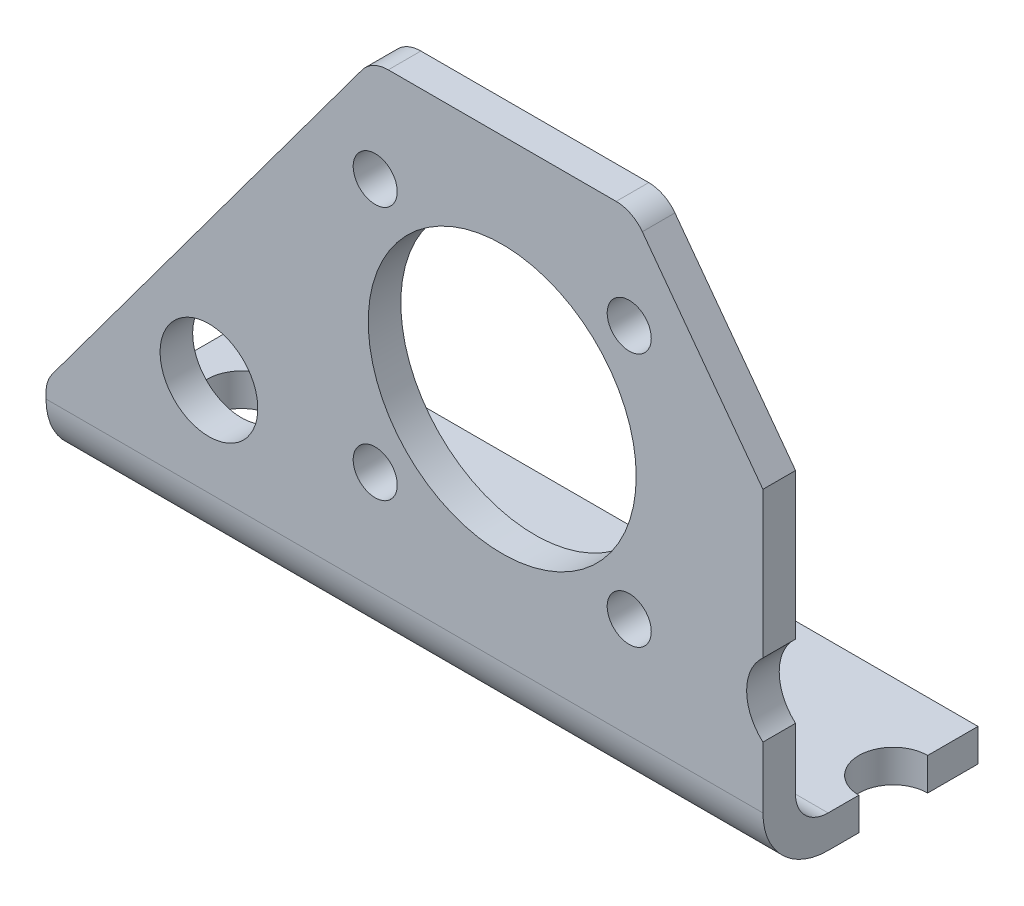
ISO-10303-21;
HEADER;
FILE_DESCRIPTION(('STEP AP214'),'2;1');
FILE_NAME('part.step','',(''),(''),'','','');
FILE_SCHEMA(('AUTOMOTIVE_DESIGN { 1 0 10303 214 1 1 1 1 }'));
ENDSEC;
DATA;
#1=APPLICATION_CONTEXT('core data for automotive mechanical design processes');
#2=APPLICATION_PROTOCOL_DEFINITION('international standard','automotive_design',2000,#1);
#3=PRODUCT_CONTEXT('',#1,'mechanical');
#4=PRODUCT('Part','Part','',(#3));
#5=PRODUCT_RELATED_PRODUCT_CATEGORY('part','',(#4));
#6=PRODUCT_DEFINITION_FORMATION('','',#4);
#7=PRODUCT_DEFINITION_CONTEXT('part definition',#1,'design');
#8=PRODUCT_DEFINITION('design','',#6,#7);
#9=PRODUCT_DEFINITION_SHAPE('','',#8);
#10=(LENGTH_UNIT() NAMED_UNIT(*) SI_UNIT(.MILLI.,.METRE.));
#11=(NAMED_UNIT(*) PLANE_ANGLE_UNIT() SI_UNIT($,.RADIAN.));
#12=(NAMED_UNIT(*) SI_UNIT($,.STERADIAN.) SOLID_ANGLE_UNIT());
#13=UNCERTAINTY_MEASURE_WITH_UNIT(LENGTH_MEASURE(1.E-05),#10,'distance_accuracy_value','');
#14=(GEOMETRIC_REPRESENTATION_CONTEXT(3) GLOBAL_UNCERTAINTY_ASSIGNED_CONTEXT((#13)) GLOBAL_UNIT_ASSIGNED_CONTEXT((#10,
#11,#12)) REPRESENTATION_CONTEXT('',''));
#15=CARTESIAN_POINT('',(0.,0.,0.));
#16=DIRECTION('',(0.,0.,1.));
#17=DIRECTION('',(1.,0.,0.));
#18=AXIS2_PLACEMENT_3D('',#15,#16,#17);
#19=CARTESIAN_POINT('',(25.4,-36.9183275870067,0.));
#20=DIRECTION('',(-1.,0.,0.));
#21=DIRECTION('',(0.,0.,1.));
#22=AXIS2_PLACEMENT_3D('',#19,#20,#21);
#23=PLANE('',#22);
#24=DIRECTION('',(0.,0.,1.));
#25=VECTOR('',#24,1.);
#26=CARTESIAN_POINT('',(25.4,-28.575,0.));
#27=LINE('',#26,#25);
#28=CARTESIAN_POINT('',(25.4,-28.5750000000001,-16.0527999999998));
#29=VERTEX_POINT('',#28);
#30=CARTESIAN_POINT('',(25.4,-28.575,-20.955));
#31=VERTEX_POINT('',#30);
#32=EDGE_CURVE('E153',#29,#31,#27,.F.);
#33=ORIENTED_EDGE('',*,*,#32,.T.);
#34=DIRECTION('',(0.,-1.,0.));
#35=VECTOR('',#34,1.);
#36=CARTESIAN_POINT('',(25.4,-28.575,-20.955));
#37=LINE('',#36,#35);
#38=CARTESIAN_POINT('',(25.4,-25.4000000000001,-20.955));
#39=VERTEX_POINT('',#38);
#40=EDGE_CURVE('E216',#31,#39,#37,.F.);
#41=ORIENTED_EDGE('',*,*,#40,.T.);
#42=DIRECTION('',(0.,0.,1.));
#43=VECTOR('',#42,1.);
#44=CARTESIAN_POINT('',(25.4,-25.4,-3.175));
#45=LINE('',#44,#43);
#46=CARTESIAN_POINT('',(25.4,-25.4,-16.0527999999998));
#47=VERTEX_POINT('',#46);
#48=EDGE_CURVE('E188',#47,#39,#45,.F.);
#49=ORIENTED_EDGE('',*,*,#48,.F.);
#50=DIRECTION('',(0.,1.,0.));
#51=VECTOR('',#50,1.);
#52=CARTESIAN_POINT('',(25.4,-28.575,-16.0527999999998));
#53=LINE('',#52,#51);
#54=EDGE_CURVE('E154',#47,#29,#53,.F.);
#55=ORIENTED_EDGE('',*,*,#54,.T.);
#56=EDGE_LOOP('',(#33,#41,#49,#55));
#57=FACE_BOUND('',#56,.T.);
#58=ADVANCED_FACE('F17',(#57),#23,.F.);
#59=CARTESIAN_POINT('',(44.45,-28.575,-20.955));
#60=DIRECTION('',(0.,0.,1.));
#61=DIRECTION('',(0.,-1.,0.));
#62=AXIS2_PLACEMENT_3D('',#59,#60,#61);
#63=PLANE('',#62);
#64=DIRECTION('',(1.,0.,0.));
#65=VECTOR('',#64,1.);
#66=CARTESIAN_POINT('',(44.45,-28.575,-20.955));
#67=LINE('',#66,#65);
#68=CARTESIAN_POINT('',(-41.275,-28.575,-20.955));
#69=VERTEX_POINT('',#68);
#70=EDGE_CURVE('E211',#31,#69,#67,.F.);
#71=ORIENTED_EDGE('',*,*,#70,.T.);
#72=DIRECTION('',(0.,1.,0.));
#73=VECTOR('',#72,1.);
#74=CARTESIAN_POINT('',(-41.275,-28.575,-20.955));
#75=LINE('',#74,#73);
#76=CARTESIAN_POINT('',(-41.275,-25.4,-20.955));
#77=VERTEX_POINT('',#76);
#78=EDGE_CURVE('E221',#77,#69,#75,.F.);
#79=ORIENTED_EDGE('',*,*,#78,.F.);
#80=DIRECTION('',(1.,0.,0.));
#81=VECTOR('',#80,1.);
#82=CARTESIAN_POINT('',(44.45,-25.4000000000001,-20.955));
#83=LINE('',#82,#81);
#84=EDGE_CURVE('E185',#39,#77,#83,.F.);
#85=ORIENTED_EDGE('',*,*,#84,.F.);
#86=ORIENTED_EDGE('',*,*,#40,.F.);
#87=EDGE_LOOP('',(#71,#79,#85,#86));
#88=FACE_BOUND('',#87,.T.);
#89=ADVANCED_FACE('F219',(#88),#63,.F.);
#90=CARTESIAN_POINT('',(-41.275,-28.575,-17.78));
#91=DIRECTION('',(0.,1.,0.));
#92=DIRECTION('',(0.,0.,1.));
#93=AXIS2_PLACEMENT_3D('',#90,#91,#92);
#94=CYLINDRICAL_SURFACE('',#93,3.175);
#95=CARTESIAN_POINT('',(-41.275,-25.4,-17.78));
#96=DIRECTION('',(0.,1.,0.));
#97=DIRECTION('',(0.,0.,1.));
#98=AXIS2_PLACEMENT_3D('',#95,#96,#97);
#99=CIRCLE('',#98,3.175);
#100=CARTESIAN_POINT('',(-44.45,-25.4,-17.78));
#101=VERTEX_POINT('',#100);
#102=EDGE_CURVE('E182',#77,#101,#99,.T.);
#103=ORIENTED_EDGE('',*,*,#102,.F.);
#104=ORIENTED_EDGE('',*,*,#78,.T.);
#105=CARTESIAN_POINT('',(-41.275,-28.575,-17.78));
#106=DIRECTION('',(0.,1.,0.));
#107=DIRECTION('',(0.,0.,1.));
#108=AXIS2_PLACEMENT_3D('',#105,#106,#107);
#109=CIRCLE('',#108,3.175);
#110=CARTESIAN_POINT('',(-44.45,-28.575,-17.78));
#111=VERTEX_POINT('',#110);
#112=EDGE_CURVE('E209',#69,#111,#109,.T.);
#113=ORIENTED_EDGE('',*,*,#112,.T.);
#114=DIRECTION('',(0.,1.,0.));
#115=VECTOR('',#114,1.);
#116=CARTESIAN_POINT('',(-44.45,-28.575,-17.78));
#117=LINE('',#116,#115);
#118=EDGE_CURVE('E229',#111,#101,#117,.T.);
#119=ORIENTED_EDGE('',*,*,#118,.T.);
#120=EDGE_LOOP('',(#103,#104,#113,#119));
#121=FACE_BOUND('',#120,.T.);
#122=ADVANCED_FACE('F228',(#121),#94,.T.);
#123=CARTESIAN_POINT('',(-38.1,-28.575,-12.6999999999998));
#124=DIRECTION('',(0.,1.,0.));
#125=DIRECTION('',(0.,0.,1.));
#126=AXIS2_PLACEMENT_3D('',#123,#124,#125);
#127=CYLINDRICAL_SURFACE('',#126,3.3528);
#128=CARTESIAN_POINT('',(-38.1,-25.4,-12.6999999999998));
#129=DIRECTION('',(0.,1.,0.));
#130=DIRECTION('',(0.,0.,1.));
#131=AXIS2_PLACEMENT_3D('',#128,#129,#130);
#132=CIRCLE('',#131,3.3528);
#133=CARTESIAN_POINT('',(-38.1,-25.4,-9.34719999999983));
#134=VERTEX_POINT('',#133);
#135=EDGE_CURVE('E176',#134,#134,#132,.F.);
#136=ORIENTED_EDGE('',*,*,#135,.F.);
#137=EDGE_LOOP('',(#136));
#138=FACE_BOUND('',#137,.T.);
#139=CARTESIAN_POINT('',(-38.1,-28.575,-12.6999999999998));
#140=DIRECTION('',(0.,1.,0.));
#141=DIRECTION('',(0.,0.,1.));
#142=AXIS2_PLACEMENT_3D('',#139,#140,#141);
#143=CIRCLE('',#142,3.3528);
#144=CARTESIAN_POINT('',(-38.1,-28.575,-9.34719999999982));
#145=VERTEX_POINT('',#144);
#146=EDGE_CURVE('E200',#145,#145,#143,.F.);
#147=ORIENTED_EDGE('',*,*,#146,.T.);
#148=EDGE_LOOP('',(#147));
#149=FACE_BOUND('',#148,.T.);
#150=ADVANCED_FACE('F621',(#138,#149),#127,.F.);
#151=CARTESIAN_POINT('',(-25.4,-28.575,-12.6999999999998));
#152=DIRECTION('',(0.,1.,0.));
#153=DIRECTION('',(0.,0.,1.));
#154=AXIS2_PLACEMENT_3D('',#151,#152,#153);
#155=CYLINDRICAL_SURFACE('',#154,3.3528);
#156=CARTESIAN_POINT('',(-25.4,-25.4,-12.6999999999998));
#157=DIRECTION('',(0.,1.,0.));
#158=DIRECTION('',(0.,0.,1.));
#159=AXIS2_PLACEMENT_3D('',#156,#157,#158);
#160=CIRCLE('',#159,3.3528);
#161=CARTESIAN_POINT('',(-25.4,-25.4,-9.34719999999983));
#162=VERTEX_POINT('',#161);
#163=EDGE_CURVE('E173',#162,#162,#160,.F.);
#164=ORIENTED_EDGE('',*,*,#163,.F.);
#165=EDGE_LOOP('',(#164));
#166=FACE_BOUND('',#165,.T.);
#167=CARTESIAN_POINT('',(-25.4,-28.575,-12.6999999999998));
#168=DIRECTION('',(0.,1.,0.));
#169=DIRECTION('',(0.,0.,1.));
#170=AXIS2_PLACEMENT_3D('',#167,#168,#169);
#171=CIRCLE('',#170,3.3528);
#172=CARTESIAN_POINT('',(-25.4,-28.575,-9.34719999999982));
#173=VERTEX_POINT('',#172);
#174=EDGE_CURVE('E203',#173,#173,#171,.F.);
#175=ORIENTED_EDGE('',*,*,#174,.T.);
#176=EDGE_LOOP('',(#175));
#177=FACE_BOUND('',#176,.T.);
#178=ADVANCED_FACE('F612',(#166,#177),#155,.F.);
#179=CARTESIAN_POINT('',(0.,-28.5750000000003,-12.6999999999998));
#180=DIRECTION('',(0.,1.,0.));
#181=DIRECTION('',(0.,0.,1.));
#182=AXIS2_PLACEMENT_3D('',#179,#180,#181);
#183=CYLINDRICAL_SURFACE('',#182,6.35);
#184=CARTESIAN_POINT('',(0.,-25.4,-12.6999999999998));
#185=DIRECTION('',(0.,1.,0.));
#186=DIRECTION('',(0.,0.,1.));
#187=AXIS2_PLACEMENT_3D('',#184,#185,#186);
#188=CIRCLE('',#187,6.35);
#189=CARTESIAN_POINT('',(0.,-25.4,-6.34999999999983));
#190=VERTEX_POINT('',#189);
#191=EDGE_CURVE('E169',#190,#190,#188,.F.);
#192=ORIENTED_EDGE('',*,*,#191,.F.);
#193=EDGE_LOOP('',(#192));
#194=FACE_BOUND('',#193,.T.);
#195=CARTESIAN_POINT('',(0.,-28.575,-12.6999999999998));
#196=DIRECTION('',(0.,1.,0.));
#197=DIRECTION('',(0.,0.,1.));
#198=AXIS2_PLACEMENT_3D('',#195,#196,#197);
#199=CIRCLE('',#198,6.35);
#200=CARTESIAN_POINT('',(0.,-28.575,-6.34999999999982));
#201=VERTEX_POINT('',#200);
#202=EDGE_CURVE('E197',#201,#201,#199,.F.);
#203=ORIENTED_EDGE('',*,*,#202,.T.);
#204=EDGE_LOOP('',(#203));
#205=FACE_BOUND('',#204,.T.);
#206=ADVANCED_FACE('F604',(#194,#205),#183,.F.);
#207=CARTESIAN_POINT('',(25.4,-28.575,-12.6999999999998));
#208=DIRECTION('',(0.,1.,0.));
#209=DIRECTION('',(0.,0.,1.));
#210=AXIS2_PLACEMENT_3D('',#207,#208,#209);
#211=CYLINDRICAL_SURFACE('',#210,3.3528);
#212=CARTESIAN_POINT('',(25.4,-28.5750000000002,-12.6999999999998));
#213=DIRECTION('',(0.,1.,0.));
#214=DIRECTION('',(0.,0.,1.));
#215=AXIS2_PLACEMENT_3D('',#212,#213,#214);
#216=CIRCLE('',#215,3.3528);
#217=CARTESIAN_POINT('',(25.4,-28.5750000000001,-9.34719999999982));
#218=VERTEX_POINT('',#217);
#219=EDGE_CURVE('E20',#218,#29,#216,.F.);
#220=ORIENTED_EDGE('',*,*,#219,.T.);
#221=ORIENTED_EDGE('',*,*,#54,.F.);
#222=CARTESIAN_POINT('',(25.4,-25.4,-12.6999999999998));
#223=DIRECTION('',(0.,1.,0.));
#224=DIRECTION('',(0.,0.,1.));
#225=AXIS2_PLACEMENT_3D('',#222,#223,#224);
#226=CIRCLE('',#225,3.3528);
#227=CARTESIAN_POINT('',(25.4,-25.4,-9.34719999999983));
#228=VERTEX_POINT('',#227);
#229=EDGE_CURVE('E141',#228,#47,#226,.F.);
#230=ORIENTED_EDGE('',*,*,#229,.F.);
#231=DIRECTION('',(0.,1.,0.));
#232=VECTOR('',#231,1.);
#233=CARTESIAN_POINT('',(25.4,-36.9183275870067,-9.34719999999982));
#234=LINE('',#233,#232);
#235=EDGE_CURVE('E136',#228,#218,#234,.F.);
#236=ORIENTED_EDGE('',*,*,#235,.T.);
#237=EDGE_LOOP('',(#220,#221,#230,#236));
#238=FACE_BOUND('',#237,.T.);
#239=ADVANCED_FACE('F138',(#238),#211,.F.);
#240=CARTESIAN_POINT('',(44.45,-28.575,-3.175));
#241=DIRECTION('',(0.,1.,0.));
#242=DIRECTION('',(0.,0.,1.));
#243=AXIS2_PLACEMENT_3D('',#240,#241,#242);
#244=PLANE('',#243);
#245=ORIENTED_EDGE('',*,*,#202,.F.);
#246=EDGE_LOOP('',(#245));
#247=FACE_BOUND('',#246,.T.);
#248=ORIENTED_EDGE('',*,*,#146,.F.);
#249=EDGE_LOOP('',(#248));
#250=FACE_BOUND('',#249,.T.);
#251=ORIENTED_EDGE('',*,*,#174,.F.);
#252=EDGE_LOOP('',(#251));
#253=FACE_BOUND('',#252,.T.);
#254=DIRECTION('',(-1.,0.,0.));
#255=VECTOR('',#254,1.);
#256=CARTESIAN_POINT('',(-44.45,-28.575,-6.34999999999998));
#257=LINE('',#256,#255);
#258=CARTESIAN_POINT('',(-44.45,-28.575,-6.34999999999999));
#259=VERTEX_POINT('',#258);
#260=CARTESIAN_POINT('',(25.4,-28.575,-6.34999999999997));
#261=VERTEX_POINT('',#260);
#262=EDGE_CURVE('E195',#259,#261,#257,.F.);
#263=ORIENTED_EDGE('',*,*,#262,.F.);
#264=DIRECTION('',(0.,0.,1.));
#265=VECTOR('',#264,1.);
#266=CARTESIAN_POINT('',(-44.45,-28.575,-20.955));
#267=LINE('',#266,#265);
#268=EDGE_CURVE('E206',#111,#259,#267,.T.);
#269=ORIENTED_EDGE('',*,*,#268,.F.);
#270=ORIENTED_EDGE('',*,*,#112,.F.);
#271=ORIENTED_EDGE('',*,*,#70,.F.);
#272=ORIENTED_EDGE('',*,*,#32,.F.);
#273=ORIENTED_EDGE('',*,*,#219,.F.);
#274=DIRECTION('',(0.,0.,1.));
#275=VECTOR('',#274,1.);
#276=CARTESIAN_POINT('',(25.4,-28.575,-3.175));
#277=LINE('',#276,#275);
#278=EDGE_CURVE('E146',#218,#261,#277,.T.);
#279=ORIENTED_EDGE('',*,*,#278,.T.);
#280=EDGE_LOOP('',(#263,#269,#270,#271,#272,#273,#279));
#281=FACE_BOUND('',#280,.T.);
#282=ADVANCED_FACE('F150',(#247,#250,#253,#281),#244,.F.);
#283=CARTESIAN_POINT('',(-44.45,-22.225,-6.35));
#284=DIRECTION('',(-1.,0.,0.));
#285=DIRECTION('',(0.,0.,1.));
#286=AXIS2_PLACEMENT_3D('',#283,#284,#285);
#287=CYLINDRICAL_SURFACE('',#286,6.35);
#288=CARTESIAN_POINT('',(-44.45,-22.225,-6.35));
#289=DIRECTION('',(-1.,0.,0.));
#290=DIRECTION('',(0.,0.,1.));
#291=AXIS2_PLACEMENT_3D('',#288,#289,#290);
#292=CIRCLE('',#291,6.35);
#293=CARTESIAN_POINT('',(-44.45,-22.225,0.));
#294=VERTEX_POINT('',#293);
#295=EDGE_CURVE('E192',#294,#259,#292,.F.);
#296=ORIENTED_EDGE('',*,*,#295,.T.);
#297=ORIENTED_EDGE('',*,*,#262,.T.);
#298=CARTESIAN_POINT('',(25.4,-22.225,-6.34999999999999));
#299=DIRECTION('',(-1.,0.,0.));
#300=DIRECTION('',(0.,0.,1.));
#301=AXIS2_PLACEMENT_3D('',#298,#299,#300);
#302=CIRCLE('',#301,6.35);
#303=CARTESIAN_POINT('',(25.4,-22.225,0.));
#304=VERTEX_POINT('',#303);
#305=EDGE_CURVE('E158',#261,#304,#302,.T.);
#306=ORIENTED_EDGE('',*,*,#305,.T.);
#307=DIRECTION('',(-1.,0.,0.));
#308=VECTOR('',#307,1.);
#309=CARTESIAN_POINT('',(0.,-22.225,0.));
#310=LINE('',#309,#308);
#311=EDGE_CURVE('E323',#304,#294,#310,.T.);
#312=ORIENTED_EDGE('',*,*,#311,.T.);
#313=EDGE_LOOP('',(#296,#297,#306,#312));
#314=FACE_BOUND('',#313,.T.);
#315=ADVANCED_FACE('F340',(#314),#287,.T.);
#316=CARTESIAN_POINT('',(44.45,-25.4,-3.175));
#317=DIRECTION('',(0.,1.,0.));
#318=DIRECTION('',(0.,0.,1.));
#319=AXIS2_PLACEMENT_3D('',#316,#317,#318);
#320=PLANE('',#319);
#321=ORIENTED_EDGE('',*,*,#191,.T.);
#322=EDGE_LOOP('',(#321));
#323=FACE_BOUND('',#322,.T.);
#324=ORIENTED_EDGE('',*,*,#163,.T.);
#325=EDGE_LOOP('',(#324));
#326=FACE_BOUND('',#325,.T.);
#327=ORIENTED_EDGE('',*,*,#135,.T.);
#328=EDGE_LOOP('',(#327));
#329=FACE_BOUND('',#328,.T.);
#330=DIRECTION('',(0.,0.,1.));
#331=VECTOR('',#330,1.);
#332=CARTESIAN_POINT('',(-44.45,-25.4,-3.175));
#333=LINE('',#332,#331);
#334=CARTESIAN_POINT('',(-44.45,-25.4,-6.34999999999999));
#335=VERTEX_POINT('',#334);
#336=EDGE_CURVE('E179',#101,#335,#333,.T.);
#337=ORIENTED_EDGE('',*,*,#336,.T.);
#338=DIRECTION('',(1.,0.,0.));
#339=VECTOR('',#338,1.);
#340=CARTESIAN_POINT('',(44.45,-25.4,-6.35));
#341=LINE('',#340,#339);
#342=CARTESIAN_POINT('',(25.4,-25.4,-6.34999999999999));
#343=VERTEX_POINT('',#342);
#344=EDGE_CURVE('E306',#335,#343,#341,.T.);
#345=ORIENTED_EDGE('',*,*,#344,.T.);
#346=DIRECTION('',(0.,0.,1.));
#347=VECTOR('',#346,1.);
#348=CARTESIAN_POINT('',(25.4,-25.4,-3.175));
#349=LINE('',#348,#347);
#350=EDGE_CURVE('E147',#343,#228,#349,.F.);
#351=ORIENTED_EDGE('',*,*,#350,.T.);
#352=ORIENTED_EDGE('',*,*,#229,.T.);
#353=ORIENTED_EDGE('',*,*,#48,.T.);
#354=ORIENTED_EDGE('',*,*,#84,.T.);
#355=ORIENTED_EDGE('',*,*,#102,.T.);
#356=EDGE_LOOP('',(#337,#345,#351,#352,#353,#354,#355));
#357=FACE_BOUND('',#356,.T.);
#358=ADVANCED_FACE('F362',(#323,#326,#329,#357),#320,.T.);
#359=CARTESIAN_POINT('',(-44.45,-28.575,-3.175));
#360=DIRECTION('',(-1.,0.,0.));
#361=DIRECTION('',(0.,0.,1.));
#362=AXIS2_PLACEMENT_3D('',#359,#360,#361);
#363=PLANE('',#362);
#364=DIRECTION('',(0.,1.,0.));
#365=VECTOR('',#364,1.);
#366=CARTESIAN_POINT('',(-44.45,-28.575,-3.175));
#367=LINE('',#366,#365);
#368=CARTESIAN_POINT('',(-44.45,-21.6853444932106,-3.175));
#369=VERTEX_POINT('',#368);
#370=CARTESIAN_POINT('',(-44.45,-22.225,-3.175));
#371=VERTEX_POINT('',#370);
#372=EDGE_CURVE('E172',#369,#371,#367,.F.);
#373=ORIENTED_EDGE('',*,*,#372,.T.);
#374=CARTESIAN_POINT('',(-44.45,-22.225,-6.35));
#375=DIRECTION('',(-1.,0.,0.));
#376=DIRECTION('',(0.,0.,1.));
#377=AXIS2_PLACEMENT_3D('',#374,#375,#376);
#378=CIRCLE('',#377,3.175);
#379=EDGE_CURVE('E307',#371,#335,#378,.F.);
#380=ORIENTED_EDGE('',*,*,#379,.T.);
#381=ORIENTED_EDGE('',*,*,#336,.F.);
#382=ORIENTED_EDGE('',*,*,#118,.F.);
#383=ORIENTED_EDGE('',*,*,#268,.T.);
#384=ORIENTED_EDGE('',*,*,#295,.F.);
#385=DIRECTION('',(0.,1.,0.));
#386=VECTOR('',#385,1.);
#387=CARTESIAN_POINT('',(-44.45,39.37,0.));
#388=LINE('',#387,#386);
#389=CARTESIAN_POINT('',(-44.45,-21.6853444932106,0.));
#390=VERTEX_POINT('',#389);
#391=EDGE_CURVE('E321',#294,#390,#388,.T.);
#392=ORIENTED_EDGE('',*,*,#391,.T.);
#393=DIRECTION('',(0.,0.,1.));
#394=VECTOR('',#393,1.);
#395=CARTESIAN_POINT('',(-44.45,-21.6853444932106,-3.175));
#396=LINE('',#395,#394);
#397=EDGE_CURVE('E303',#369,#390,#396,.T.);
#398=ORIENTED_EDGE('',*,*,#397,.F.);
#399=EDGE_LOOP('',(#373,#380,#381,#382,#383,#384,#392,#398));
#400=FACE_BOUND('',#399,.T.);
#401=ADVANCED_FACE('F233',(#400),#363,.T.);
#402=CARTESIAN_POINT('',(0.,39.37,0.));
#403=DIRECTION('',(0.,0.,-1.));
#404=DIRECTION('',(-1.,0.,0.));
#405=AXIS2_PLACEMENT_3D('',#402,#403,#404);
#406=PLANE('',#405);
#407=CARTESIAN_POINT('',(-12.3747929348331,12.3747929348334,0.));
#408=DIRECTION('',(0.,0.,1.));
#409=DIRECTION('',(1.,0.,0.));
#410=AXIS2_PLACEMENT_3D('',#407,#408,#409);
#411=CIRCLE('',#410,2.1463);
#412=CARTESIAN_POINT('',(-10.2284929348331,12.3747929348334,0.));
#413=VERTEX_POINT('',#412);
#414=EDGE_CURVE('E287',#413,#413,#411,.F.);
#415=ORIENTED_EDGE('',*,*,#414,.T.);
#416=EDGE_LOOP('',(#415));
#417=FACE_BOUND('',#416,.T.);
#418=CARTESIAN_POINT('',(-12.3747929348334,-12.3747929348332,0.));
#419=DIRECTION('',(0.,0.,1.));
#420=DIRECTION('',(1.,0.,0.));
#421=AXIS2_PLACEMENT_3D('',#418,#419,#420);
#422=CIRCLE('',#421,2.1463);
#423=CARTESIAN_POINT('',(-10.2284929348334,-12.3747929348332,0.));
#424=VERTEX_POINT('',#423);
#425=EDGE_CURVE('E284',#424,#424,#422,.F.);
#426=ORIENTED_EDGE('',*,*,#425,.T.);
#427=EDGE_LOOP('',(#426));
#428=FACE_BOUND('',#427,.T.);
#429=CARTESIAN_POINT('',(12.3747929348332,-12.3747929348334,0.));
#430=DIRECTION('',(0.,0.,1.));
#431=DIRECTION('',(1.,0.,0.));
#432=AXIS2_PLACEMENT_3D('',#429,#430,#431);
#433=CIRCLE('',#432,2.1463);
#434=CARTESIAN_POINT('',(14.5210929348332,-12.3747929348334,0.));
#435=VERTEX_POINT('',#434);
#436=EDGE_CURVE('E281',#435,#435,#433,.F.);
#437=ORIENTED_EDGE('',*,*,#436,.T.);
#438=EDGE_LOOP('',(#437));
#439=FACE_BOUND('',#438,.T.);
#440=CARTESIAN_POINT('',(12.3747929348333,12.3747929348333,0.));
#441=DIRECTION('',(0.,0.,1.));
#442=DIRECTION('',(1.,0.,0.));
#443=AXIS2_PLACEMENT_3D('',#440,#441,#442);
#444=CIRCLE('',#443,2.1463);
#445=CARTESIAN_POINT('',(14.5210929348333,12.3747929348333,0.));
#446=VERTEX_POINT('',#445);
#447=EDGE_CURVE('E278',#446,#446,#444,.F.);
#448=ORIENTED_EDGE('',*,*,#447,.T.);
#449=EDGE_LOOP('',(#448));
#450=FACE_BOUND('',#449,.T.);
#451=CARTESIAN_POINT('',(0.,0.,0.));
#452=DIRECTION('',(0.,0.,1.));
#453=DIRECTION('',(1.,0.,0.));
#454=AXIS2_PLACEMENT_3D('',#451,#452,#453);
#455=CIRCLE('',#454,13.0556);
#456=CARTESIAN_POINT('',(13.0556,0.,0.));
#457=VERTEX_POINT('',#456);
#458=EDGE_CURVE('E275',#457,#457,#455,.F.);
#459=ORIENTED_EDGE('',*,*,#458,.T.);
#460=EDGE_LOOP('',(#459));
#461=FACE_BOUND('',#460,.T.);
#462=CARTESIAN_POINT('',(-28.575,-12.7,0.));
#463=DIRECTION('',(0.,0.,-1.));
#464=DIRECTION('',(-1.,0.,0.));
#465=AXIS2_PLACEMENT_3D('',#462,#463,#464);
#466=CIRCLE('',#465,4.7625);
#467=CARTESIAN_POINT('',(-33.3375,-12.7,0.));
#468=VERTEX_POINT('',#467);
#469=EDGE_CURVE('E272',#468,#468,#466,.T.);
#470=ORIENTED_EDGE('',*,*,#469,.T.);
#471=EDGE_LOOP('',(#470));
#472=FACE_BOUND('',#471,.T.);
#473=DIRECTION('',(-0.595227550625738,0.803557193344746,0.));
#474=VECTOR('',#473,1.);
#475=CARTESIAN_POINT('',(12.7,22.225,0.));
#476=LINE('',#475,#474);
#477=CARTESIAN_POINT('',(13.6519648346395,20.9398474732367,0.));
#478=VERTEX_POINT('',#477);
#479=CARTESIAN_POINT('',(25.4,5.08,0.));
#480=VERTEX_POINT('',#479);
#481=EDGE_CURVE('E290',#478,#480,#476,.F.);
#482=ORIENTED_EDGE('',*,*,#481,.F.);
#483=CARTESIAN_POINT('',(11.1006707457699,19.05,0.));
#484=DIRECTION('',(0.,0.,1.));
#485=DIRECTION('',(1.,0.,0.));
#486=AXIS2_PLACEMENT_3D('',#483,#484,#485);
#487=CIRCLE('',#486,3.175);
#488=CARTESIAN_POINT('',(11.1006707457699,22.225,0.));
#489=VERTEX_POINT('',#488);
#490=EDGE_CURVE('E291',#489,#478,#487,.F.);
#491=ORIENTED_EDGE('',*,*,#490,.F.);
#492=DIRECTION('',(1.,0.,0.));
#493=VECTOR('',#492,1.);
#494=CARTESIAN_POINT('',(-12.7,22.225,0.));
#495=LINE('',#494,#493);
#496=CARTESIAN_POINT('',(-11.1006707457699,22.225,0.));
#497=VERTEX_POINT('',#496);
#498=EDGE_CURVE('E298',#497,#489,#495,.T.);
#499=ORIENTED_EDGE('',*,*,#498,.F.);
#500=CARTESIAN_POINT('',(-11.1006707457699,19.05,0.));
#501=DIRECTION('',(0.,0.,1.));
#502=DIRECTION('',(1.,0.,0.));
#503=AXIS2_PLACEMENT_3D('',#500,#501,#502);
#504=CIRCLE('',#503,3.175);
#505=CARTESIAN_POINT('',(-13.6519648346395,20.9398474732367,0.));
#506=VERTEX_POINT('',#505);
#507=EDGE_CURVE('E295',#506,#497,#504,.F.);
#508=ORIENTED_EDGE('',*,*,#507,.F.);
#509=DIRECTION('',(-0.595227550625738,-0.803557193344746,0.));
#510=VECTOR('',#509,1.);
#511=CARTESIAN_POINT('',(-44.45,-20.6375,0.));
#512=LINE('',#511,#510);
#513=CARTESIAN_POINT('',(-43.8262940888696,-19.7954970199739,0.));
#514=VERTEX_POINT('',#513);
#515=EDGE_CURVE('E334',#514,#506,#512,.F.);
#516=ORIENTED_EDGE('',*,*,#515,.F.);
#517=CARTESIAN_POINT('',(-41.275,-21.6853444932106,0.));
#518=DIRECTION('',(0.,0.,1.));
#519=DIRECTION('',(1.,0.,0.));
#520=AXIS2_PLACEMENT_3D('',#517,#518,#519);
#521=CIRCLE('',#520,3.175);
#522=EDGE_CURVE('E300',#390,#514,#521,.F.);
#523=ORIENTED_EDGE('',*,*,#522,.F.);
#524=ORIENTED_EDGE('',*,*,#391,.F.);
#525=ORIENTED_EDGE('',*,*,#311,.F.);
#526=DIRECTION('',(0.,1.,0.));
#527=VECTOR('',#526,1.);
#528=CARTESIAN_POINT('',(25.4,-36.9183275870067,0.));
#529=LINE('',#528,#527);
#530=CARTESIAN_POINT('',(25.4,-16.2497579142809,0.));
#531=VERTEX_POINT('',#530);
#532=EDGE_CURVE('E160',#304,#531,#529,.T.);
#533=ORIENTED_EDGE('',*,*,#532,.T.);
#534=CARTESIAN_POINT('',(28.575,-12.7,0.));
#535=DIRECTION('',(0.,0.,-1.));
#536=DIRECTION('',(-1.,0.,0.));
#537=AXIS2_PLACEMENT_3D('',#534,#535,#536);
#538=CIRCLE('',#537,4.7625);
#539=CARTESIAN_POINT('',(25.4,-9.15024208571908,0.));
#540=VERTEX_POINT('',#539);
#541=EDGE_CURVE('E166',#531,#540,#538,.T.);
#542=ORIENTED_EDGE('',*,*,#541,.T.);
#543=DIRECTION('',(0.,1.,0.));
#544=VECTOR('',#543,1.);
#545=CARTESIAN_POINT('',(25.4,-36.9183275870067,0.));
#546=LINE('',#545,#544);
#547=EDGE_CURVE('E168',#540,#480,#546,.T.);
#548=ORIENTED_EDGE('',*,*,#547,.T.);
#549=EDGE_LOOP('',(#482,#491,#499,#508,#516,#523,#524,#525,#533,#542,#548));
#550=FACE_BOUND('',#549,.T.);
#551=ADVANCED_FACE('F344',(#417,#428,#439,#450,#461,#472,#550),#406,.F.);
#552=CARTESIAN_POINT('',(25.4,-36.9183275870067,0.));
#553=DIRECTION('',(-1.,0.,0.));
#554=DIRECTION('',(0.,0.,1.));
#555=AXIS2_PLACEMENT_3D('',#552,#553,#554);
#556=PLANE('',#555);
#557=ORIENTED_EDGE('',*,*,#547,.F.);
#558=DIRECTION('',(0.,0.,-1.));
#559=VECTOR('',#558,1.);
#560=CARTESIAN_POINT('',(25.4,-9.15024208571908,0.));
#561=LINE('',#560,#559);
#562=CARTESIAN_POINT('',(25.4,-9.15024208571908,-3.175));
#563=VERTEX_POINT('',#562);
#564=EDGE_CURVE('E165',#540,#563,#561,.T.);
#565=ORIENTED_EDGE('',*,*,#564,.T.);
#566=DIRECTION('',(0.,1.,0.));
#567=VECTOR('',#566,1.);
#568=CARTESIAN_POINT('',(25.4,39.37,-3.175));
#569=LINE('',#568,#567);
#570=CARTESIAN_POINT('',(25.4,5.08,-3.175));
#571=VERTEX_POINT('',#570);
#572=EDGE_CURVE('E271',#571,#563,#569,.F.);
#573=ORIENTED_EDGE('',*,*,#572,.F.);
#574=DIRECTION('',(0.,0.,1.));
#575=VECTOR('',#574,1.);
#576=CARTESIAN_POINT('',(25.4,5.08,-3.175));
#577=LINE('',#576,#575);
#578=EDGE_CURVE('E293',#480,#571,#577,.F.);
#579=ORIENTED_EDGE('',*,*,#578,.F.);
#580=EDGE_LOOP('',(#557,#565,#573,#579));
#581=FACE_BOUND('',#580,.T.);
#582=ADVANCED_FACE('F371',(#581),#556,.F.);
#583=CARTESIAN_POINT('',(28.575,-12.7,0.));
#584=DIRECTION('',(0.,0.,-1.));
#585=DIRECTION('',(-1.,0.,0.));
#586=AXIS2_PLACEMENT_3D('',#583,#584,#585);
#587=CYLINDRICAL_SURFACE('',#586,4.7625);
#588=ORIENTED_EDGE('',*,*,#541,.F.);
#589=DIRECTION('',(0.,0.,1.));
#590=VECTOR('',#589,1.);
#591=CARTESIAN_POINT('',(25.4,-16.2497579142809,0.));
#592=LINE('',#591,#590);
#593=CARTESIAN_POINT('',(25.4,-16.2497579142809,-3.175));
#594=VERTEX_POINT('',#593);
#595=EDGE_CURVE('E308',#531,#594,#592,.F.);
#596=ORIENTED_EDGE('',*,*,#595,.T.);
#597=CARTESIAN_POINT('',(28.575,-12.7,-3.175));
#598=DIRECTION('',(0.,0.,-1.));
#599=DIRECTION('',(-1.,0.,0.));
#600=AXIS2_PLACEMENT_3D('',#597,#598,#599);
#601=CIRCLE('',#600,4.7625);
#602=EDGE_CURVE('E267',#563,#594,#601,.F.);
#603=ORIENTED_EDGE('',*,*,#602,.F.);
#604=ORIENTED_EDGE('',*,*,#564,.F.);
#605=EDGE_LOOP('',(#588,#596,#603,#604));
#606=FACE_BOUND('',#605,.T.);
#607=ADVANCED_FACE('F368',(#606),#587,.F.);
#608=CARTESIAN_POINT('',(25.4,-36.9183275870067,0.));
#609=DIRECTION('',(-1.,0.,0.));
#610=DIRECTION('',(0.,0.,1.));
#611=AXIS2_PLACEMENT_3D('',#608,#609,#610);
#612=PLANE('',#611);
#613=ORIENTED_EDGE('',*,*,#532,.F.);
#614=ORIENTED_EDGE('',*,*,#305,.F.);
#615=ORIENTED_EDGE('',*,*,#278,.F.);
#616=ORIENTED_EDGE('',*,*,#235,.F.);
#617=ORIENTED_EDGE('',*,*,#350,.F.);
#618=CARTESIAN_POINT('',(25.4,-22.225,-6.34999999999999));
#619=DIRECTION('',(-1.,0.,0.));
#620=DIRECTION('',(0.,0.,1.));
#621=AXIS2_PLACEMENT_3D('',#618,#619,#620);
#622=CIRCLE('',#621,3.175);
#623=CARTESIAN_POINT('',(25.4,-22.225,-3.175));
#624=VERTEX_POINT('',#623);
#625=EDGE_CURVE('E304',#343,#624,#622,.T.);
#626=ORIENTED_EDGE('',*,*,#625,.T.);
#627=DIRECTION('',(0.,1.,0.));
#628=VECTOR('',#627,1.);
#629=CARTESIAN_POINT('',(25.4,39.37,-3.175));
#630=LINE('',#629,#628);
#631=EDGE_CURVE('E270',#594,#624,#630,.F.);
#632=ORIENTED_EDGE('',*,*,#631,.F.);
#633=ORIENTED_EDGE('',*,*,#595,.F.);
#634=EDGE_LOOP('',(#613,#614,#615,#616,#617,#626,#632,#633));
#635=FACE_BOUND('',#634,.T.);
#636=ADVANCED_FACE('F157',(#635),#612,.F.);
#637=CARTESIAN_POINT('',(-44.45,-22.225,-6.35));
#638=DIRECTION('',(-1.,0.,0.));
#639=DIRECTION('',(0.,0.,1.));
#640=AXIS2_PLACEMENT_3D('',#637,#638,#639);
#641=CYLINDRICAL_SURFACE('',#640,3.175);
#642=ORIENTED_EDGE('',*,*,#344,.F.);
#643=ORIENTED_EDGE('',*,*,#379,.F.);
#644=DIRECTION('',(-1.,0.,0.));
#645=VECTOR('',#644,1.);
#646=CARTESIAN_POINT('',(0.,-22.225,-3.175));
#647=LINE('',#646,#645);
#648=EDGE_CURVE('E266',#624,#371,#647,.T.);
#649=ORIENTED_EDGE('',*,*,#648,.F.);
#650=ORIENTED_EDGE('',*,*,#625,.F.);
#651=EDGE_LOOP('',(#642,#643,#649,#650));
#652=FACE_BOUND('',#651,.T.);
#653=ADVANCED_FACE('F360',(#652),#641,.F.);
#654=CARTESIAN_POINT('',(-41.275,-21.6853444932106,-3.175));
#655=DIRECTION('',(0.,0.,1.));
#656=DIRECTION('',(1.,0.,0.));
#657=AXIS2_PLACEMENT_3D('',#654,#655,#656);
#658=CYLINDRICAL_SURFACE('',#657,3.175);
#659=ORIENTED_EDGE('',*,*,#522,.T.);
#660=DIRECTION('',(0.,0.,1.));
#661=VECTOR('',#660,1.);
#662=CARTESIAN_POINT('',(-43.8262940888695,-19.7954970199739,-3.175));
#663=LINE('',#662,#661);
#664=CARTESIAN_POINT('',(-43.8262940888695,-19.7954970199739,-3.175));
#665=VERTEX_POINT('',#664);
#666=EDGE_CURVE('E302',#665,#514,#663,.T.);
#667=ORIENTED_EDGE('',*,*,#666,.F.);
#668=CARTESIAN_POINT('',(-41.275,-21.6853444932106,-3.175));
#669=DIRECTION('',(0.,0.,1.));
#670=DIRECTION('',(1.,0.,0.));
#671=AXIS2_PLACEMENT_3D('',#668,#669,#670);
#672=CIRCLE('',#671,3.175);
#673=EDGE_CURVE('E263',#369,#665,#672,.F.);
#674=ORIENTED_EDGE('',*,*,#673,.F.);
#675=ORIENTED_EDGE('',*,*,#397,.T.);
#676=EDGE_LOOP('',(#659,#667,#674,#675));
#677=FACE_BOUND('',#676,.T.);
#678=ADVANCED_FACE('F350',(#677),#658,.T.);
#679=CARTESIAN_POINT('',(-44.45,-20.6375,-3.175));
#680=DIRECTION('',(-0.803557193344746,0.595227550625738,0.));
#681=DIRECTION('',(-0.595227550625738,-0.803557193344746,0.));
#682=AXIS2_PLACEMENT_3D('',#679,#680,#681);
#683=PLANE('',#682);
#684=ORIENTED_EDGE('',*,*,#515,.T.);
#685=DIRECTION('',(0.,0.,1.));
#686=VECTOR('',#685,1.);
#687=CARTESIAN_POINT('',(-13.6519648346395,20.9398474732367,-3.175));
#688=LINE('',#687,#686);
#689=CARTESIAN_POINT('',(-13.6519648346395,20.9398474732367,-3.175));
#690=VERTEX_POINT('',#689);
#691=EDGE_CURVE('E299',#690,#506,#688,.T.);
#692=ORIENTED_EDGE('',*,*,#691,.F.);
#693=DIRECTION('',(0.595227550625737,0.803557193344747,0.));
#694=VECTOR('',#693,1.);
#695=CARTESIAN_POINT('',(-43.8262940888695,-19.7954970199739,-3.175));
#696=LINE('',#695,#694);
#697=EDGE_CURVE('E262',#665,#690,#696,.T.);
#698=ORIENTED_EDGE('',*,*,#697,.F.);
#699=ORIENTED_EDGE('',*,*,#666,.T.);
#700=EDGE_LOOP('',(#684,#692,#698,#699));
#701=FACE_BOUND('',#700,.T.);
#702=ADVANCED_FACE('F393',(#701),#683,.T.);
#703=CARTESIAN_POINT('',(-11.1006707457699,19.05,-3.175));
#704=DIRECTION('',(0.,0.,1.));
#705=DIRECTION('',(1.,0.,0.));
#706=AXIS2_PLACEMENT_3D('',#703,#704,#705);
#707=CYLINDRICAL_SURFACE('',#706,3.175);
#708=ORIENTED_EDGE('',*,*,#507,.T.);
#709=DIRECTION('',(0.,0.,1.));
#710=VECTOR('',#709,1.);
#711=CARTESIAN_POINT('',(-11.1006707457699,22.225,-3.175));
#712=LINE('',#711,#710);
#713=CARTESIAN_POINT('',(-11.1006707457699,22.225,-3.175));
#714=VERTEX_POINT('',#713);
#715=EDGE_CURVE('E333',#714,#497,#712,.T.);
#716=ORIENTED_EDGE('',*,*,#715,.F.);
#717=CARTESIAN_POINT('',(-11.1006707457699,19.05,-3.175));
#718=DIRECTION('',(0.,0.,1.));
#719=DIRECTION('',(1.,0.,0.));
#720=AXIS2_PLACEMENT_3D('',#717,#718,#719);
#721=CIRCLE('',#720,3.175);
#722=EDGE_CURVE('E259',#690,#714,#721,.F.);
#723=ORIENTED_EDGE('',*,*,#722,.F.);
#724=ORIENTED_EDGE('',*,*,#691,.T.);
#725=EDGE_LOOP('',(#708,#716,#723,#724));
#726=FACE_BOUND('',#725,.T.);
#727=ADVANCED_FACE('F407',(#726),#707,.T.);
#728=CARTESIAN_POINT('',(-12.7,22.225,-3.175));
#729=DIRECTION('',(0.,1.,0.));
#730=DIRECTION('',(0.,0.,1.));
#731=AXIS2_PLACEMENT_3D('',#728,#729,#730);
#732=PLANE('',#731);
#733=DIRECTION('',(-1.,0.,0.));
#734=VECTOR('',#733,1.);
#735=CARTESIAN_POINT('',(0.,22.225,-3.175));
#736=LINE('',#735,#734);
#737=CARTESIAN_POINT('',(11.1006707457699,22.225,-3.175));
#738=VERTEX_POINT('',#737);
#739=EDGE_CURVE('E258',#714,#738,#736,.F.);
#740=ORIENTED_EDGE('',*,*,#739,.F.);
#741=ORIENTED_EDGE('',*,*,#715,.T.);
#742=ORIENTED_EDGE('',*,*,#498,.T.);
#743=DIRECTION('',(0.,0.,1.));
#744=VECTOR('',#743,1.);
#745=CARTESIAN_POINT('',(11.1006707457699,22.225,-3.175));
#746=LINE('',#745,#744);
#747=EDGE_CURVE('E294',#738,#489,#746,.T.);
#748=ORIENTED_EDGE('',*,*,#747,.F.);
#749=EDGE_LOOP('',(#740,#741,#742,#748));
#750=FACE_BOUND('',#749,.T.);
#751=ADVANCED_FACE('F405',(#750),#732,.T.);
#752=CARTESIAN_POINT('',(11.1006707457699,19.05,-3.175));
#753=DIRECTION('',(0.,0.,1.));
#754=DIRECTION('',(1.,0.,0.));
#755=AXIS2_PLACEMENT_3D('',#752,#753,#754);
#756=CYLINDRICAL_SURFACE('',#755,3.175);
#757=ORIENTED_EDGE('',*,*,#490,.T.);
#758=DIRECTION('',(0.,0.,1.));
#759=VECTOR('',#758,1.);
#760=CARTESIAN_POINT('',(13.6519648346395,20.9398474732367,-3.175));
#761=LINE('',#760,#759);
#762=CARTESIAN_POINT('',(13.6519648346395,20.9398474732367,-3.175));
#763=VERTEX_POINT('',#762);
#764=EDGE_CURVE('E35',#763,#478,#761,.T.);
#765=ORIENTED_EDGE('',*,*,#764,.F.);
#766=CARTESIAN_POINT('',(11.1006707457699,19.05,-3.175));
#767=DIRECTION('',(0.,0.,1.));
#768=DIRECTION('',(1.,0.,0.));
#769=AXIS2_PLACEMENT_3D('',#766,#767,#768);
#770=CIRCLE('',#769,3.175);
#771=EDGE_CURVE('E255',#738,#763,#770,.F.);
#772=ORIENTED_EDGE('',*,*,#771,.F.);
#773=ORIENTED_EDGE('',*,*,#747,.T.);
#774=EDGE_LOOP('',(#757,#765,#772,#773));
#775=FACE_BOUND('',#774,.T.);
#776=ADVANCED_FACE('F403',(#775),#756,.T.);
#777=CARTESIAN_POINT('',(12.7,22.225,-3.175));
#778=DIRECTION('',(0.803557193344746,0.595227550625738,0.));
#779=DIRECTION('',(-0.595227550625738,0.803557193344746,0.));
#780=AXIS2_PLACEMENT_3D('',#777,#778,#779);
#781=PLANE('',#780);
#782=ORIENTED_EDGE('',*,*,#764,.T.);
#783=ORIENTED_EDGE('',*,*,#481,.T.);
#784=ORIENTED_EDGE('',*,*,#578,.T.);
#785=DIRECTION('',(0.595227550625738,-0.803557193344746,0.));
#786=VECTOR('',#785,1.);
#787=CARTESIAN_POINT('',(13.6519648346395,20.9398474732367,-3.175));
#788=LINE('',#787,#786);
#789=EDGE_CURVE('E254',#763,#571,#788,.T.);
#790=ORIENTED_EDGE('',*,*,#789,.F.);
#791=EDGE_LOOP('',(#782,#783,#784,#790));
#792=FACE_BOUND('',#791,.T.);
#793=ADVANCED_FACE('F378',(#792),#781,.T.);
#794=CARTESIAN_POINT('',(-12.3747929348331,12.3747929348334,-3.175));
#795=DIRECTION('',(0.,0.,1.));
#796=DIRECTION('',(1.,0.,0.));
#797=AXIS2_PLACEMENT_3D('',#794,#795,#796);
#798=CYLINDRICAL_SURFACE('',#797,2.1463);
#799=ORIENTED_EDGE('',*,*,#414,.F.);
#800=EDGE_LOOP('',(#799));
#801=FACE_BOUND('',#800,.T.);
#802=CARTESIAN_POINT('',(-12.3747929348331,12.3747929348334,-3.175));
#803=DIRECTION('',(0.,0.,1.));
#804=DIRECTION('',(1.,0.,0.));
#805=AXIS2_PLACEMENT_3D('',#802,#803,#804);
#806=CIRCLE('',#805,2.1463);
#807=CARTESIAN_POINT('',(-10.2284929348331,12.3747929348334,-3.175));
#808=VERTEX_POINT('',#807);
#809=EDGE_CURVE('E251',#808,#808,#806,.T.);
#810=ORIENTED_EDGE('',*,*,#809,.F.);
#811=EDGE_LOOP('',(#810));
#812=FACE_BOUND('',#811,.T.);
#813=ADVANCED_FACE('F443',(#801,#812),#798,.F.);
#814=CARTESIAN_POINT('',(-12.3747929348334,-12.3747929348332,-3.175));
#815=DIRECTION('',(0.,0.,1.));
#816=DIRECTION('',(1.,0.,0.));
#817=AXIS2_PLACEMENT_3D('',#814,#815,#816);
#818=CYLINDRICAL_SURFACE('',#817,2.1463);
#819=ORIENTED_EDGE('',*,*,#425,.F.);
#820=EDGE_LOOP('',(#819));
#821=FACE_BOUND('',#820,.T.);
#822=CARTESIAN_POINT('',(-12.3747929348334,-12.3747929348332,-3.175));
#823=DIRECTION('',(0.,0.,1.));
#824=DIRECTION('',(1.,0.,0.));
#825=AXIS2_PLACEMENT_3D('',#822,#823,#824);
#826=CIRCLE('',#825,2.1463);
#827=CARTESIAN_POINT('',(-10.2284929348334,-12.3747929348332,-3.175));
#828=VERTEX_POINT('',#827);
#829=EDGE_CURVE('E248',#828,#828,#826,.T.);
#830=ORIENTED_EDGE('',*,*,#829,.F.);
#831=EDGE_LOOP('',(#830));
#832=FACE_BOUND('',#831,.T.);
#833=ADVANCED_FACE('F439',(#821,#832),#818,.F.);
#834=CARTESIAN_POINT('',(12.3747929348332,-12.3747929348334,-3.175));
#835=DIRECTION('',(0.,0.,1.));
#836=DIRECTION('',(1.,0.,0.));
#837=AXIS2_PLACEMENT_3D('',#834,#835,#836);
#838=CYLINDRICAL_SURFACE('',#837,2.1463);
#839=ORIENTED_EDGE('',*,*,#436,.F.);
#840=EDGE_LOOP('',(#839));
#841=FACE_BOUND('',#840,.T.);
#842=CARTESIAN_POINT('',(12.3747929348332,-12.3747929348334,-3.175));
#843=DIRECTION('',(0.,0.,1.));
#844=DIRECTION('',(1.,0.,0.));
#845=AXIS2_PLACEMENT_3D('',#842,#843,#844);
#846=CIRCLE('',#845,2.1463);
#847=CARTESIAN_POINT('',(14.5210929348332,-12.3747929348334,-3.175));
#848=VERTEX_POINT('',#847);
#849=EDGE_CURVE('E245',#848,#848,#846,.T.);
#850=ORIENTED_EDGE('',*,*,#849,.F.);
#851=EDGE_LOOP('',(#850));
#852=FACE_BOUND('',#851,.T.);
#853=ADVANCED_FACE('F435',(#841,#852),#838,.F.);
#854=CARTESIAN_POINT('',(12.3747929348333,12.3747929348333,-3.175));
#855=DIRECTION('',(0.,0.,1.));
#856=DIRECTION('',(1.,0.,0.));
#857=AXIS2_PLACEMENT_3D('',#854,#855,#856);
#858=CYLINDRICAL_SURFACE('',#857,2.1463);
#859=ORIENTED_EDGE('',*,*,#447,.F.);
#860=EDGE_LOOP('',(#859));
#861=FACE_BOUND('',#860,.T.);
#862=CARTESIAN_POINT('',(12.3747929348333,12.3747929348333,-3.175));
#863=DIRECTION('',(0.,0.,1.));
#864=DIRECTION('',(1.,0.,0.));
#865=AXIS2_PLACEMENT_3D('',#862,#863,#864);
#866=CIRCLE('',#865,2.1463);
#867=CARTESIAN_POINT('',(14.5210929348333,12.3747929348333,-3.175));
#868=VERTEX_POINT('',#867);
#869=EDGE_CURVE('E242',#868,#868,#866,.T.);
#870=ORIENTED_EDGE('',*,*,#869,.F.);
#871=EDGE_LOOP('',(#870));
#872=FACE_BOUND('',#871,.T.);
#873=ADVANCED_FACE('F431',(#861,#872),#858,.F.);
#874=CARTESIAN_POINT('',(0.,0.,-3.175));
#875=DIRECTION('',(0.,0.,1.));
#876=DIRECTION('',(1.,0.,0.));
#877=AXIS2_PLACEMENT_3D('',#874,#875,#876);
#878=CYLINDRICAL_SURFACE('',#877,13.0556);
#879=ORIENTED_EDGE('',*,*,#458,.F.);
#880=EDGE_LOOP('',(#879));
#881=FACE_BOUND('',#880,.T.);
#882=CARTESIAN_POINT('',(0.,0.,-3.175));
#883=DIRECTION('',(0.,0.,1.));
#884=DIRECTION('',(1.,0.,0.));
#885=AXIS2_PLACEMENT_3D('',#882,#883,#884);
#886=CIRCLE('',#885,13.0556);
#887=CARTESIAN_POINT('',(13.0556,0.,-3.175));
#888=VERTEX_POINT('',#887);
#889=EDGE_CURVE('E26',#888,#888,#886,.T.);
#890=ORIENTED_EDGE('',*,*,#889,.F.);
#891=EDGE_LOOP('',(#890));
#892=FACE_BOUND('',#891,.T.);
#893=ADVANCED_FACE('F424',(#881,#892),#878,.F.);
#894=CARTESIAN_POINT('',(-28.575,-12.7,0.));
#895=DIRECTION('',(0.,0.,-1.));
#896=DIRECTION('',(-1.,0.,0.));
#897=AXIS2_PLACEMENT_3D('',#894,#895,#896);
#898=CYLINDRICAL_SURFACE('',#897,4.7625);
#899=CARTESIAN_POINT('',(-28.575,-12.7,-3.175));
#900=DIRECTION('',(0.,0.,-1.));
#901=DIRECTION('',(-1.,0.,0.));
#902=AXIS2_PLACEMENT_3D('',#899,#900,#901);
#903=CIRCLE('',#902,4.7625);
#904=CARTESIAN_POINT('',(-33.3375,-12.7,-3.175));
#905=VERTEX_POINT('',#904);
#906=EDGE_CURVE('E11',#905,#905,#903,.F.);
#907=ORIENTED_EDGE('',*,*,#906,.F.);
#908=EDGE_LOOP('',(#907));
#909=FACE_BOUND('',#908,.T.);
#910=ORIENTED_EDGE('',*,*,#469,.F.);
#911=EDGE_LOOP('',(#910));
#912=FACE_BOUND('',#911,.T.);
#913=ADVANCED_FACE('F418',(#909,#912),#898,.F.);
#914=CARTESIAN_POINT('',(0.,39.37,-3.175));
#915=DIRECTION('',(0.,0.,-1.));
#916=DIRECTION('',(-1.,0.,0.));
#917=AXIS2_PLACEMENT_3D('',#914,#915,#916);
#918=PLANE('',#917);
#919=ORIENTED_EDGE('',*,*,#906,.T.);
#920=EDGE_LOOP('',(#919));
#921=FACE_BOUND('',#920,.T.);
#922=ORIENTED_EDGE('',*,*,#889,.T.);
#923=EDGE_LOOP('',(#922));
#924=FACE_BOUND('',#923,.T.);
#925=ORIENTED_EDGE('',*,*,#869,.T.);
#926=EDGE_LOOP('',(#925));
#927=FACE_BOUND('',#926,.T.);
#928=ORIENTED_EDGE('',*,*,#849,.T.);
#929=EDGE_LOOP('',(#928));
#930=FACE_BOUND('',#929,.T.);
#931=ORIENTED_EDGE('',*,*,#829,.T.);
#932=EDGE_LOOP('',(#931));
#933=FACE_BOUND('',#932,.T.);
#934=ORIENTED_EDGE('',*,*,#809,.T.);
#935=EDGE_LOOP('',(#934));
#936=FACE_BOUND('',#935,.T.);
#937=ORIENTED_EDGE('',*,*,#771,.T.);
#938=ORIENTED_EDGE('',*,*,#789,.T.);
#939=ORIENTED_EDGE('',*,*,#572,.T.);
#940=ORIENTED_EDGE('',*,*,#602,.T.);
#941=ORIENTED_EDGE('',*,*,#631,.T.);
#942=ORIENTED_EDGE('',*,*,#648,.T.);
#943=ORIENTED_EDGE('',*,*,#372,.F.);
#944=ORIENTED_EDGE('',*,*,#673,.T.);
#945=ORIENTED_EDGE('',*,*,#697,.T.);
#946=ORIENTED_EDGE('',*,*,#722,.T.);
#947=ORIENTED_EDGE('',*,*,#739,.T.);
#948=EDGE_LOOP('',(#937,#938,#939,#940,#941,#942,#943,#944,#945,#946,#947));
#949=FACE_BOUND('',#948,.T.);
#950=ADVANCED_FACE('F355',(#921,#924,#927,#930,#933,#936,#949),#918,.T.);
#951=CLOSED_SHELL('',(#58,#89,#122,#150,#178,#206,#239,#282,#315,#358,#401,#551,#582,#607,#636,
#653,#678,#702,#727,#751,#776,#793,#813,#833,#853,#873,#893,#913,#950));
#952=MANIFOLD_SOLID_BREP('B1',#951);
#953=ADVANCED_BREP_SHAPE_REPRESENTATION('',(#18,#952),#14);
#954=SHAPE_DEFINITION_REPRESENTATION(#9,#953);
ENDSEC;
END-ISO-10303-21;
